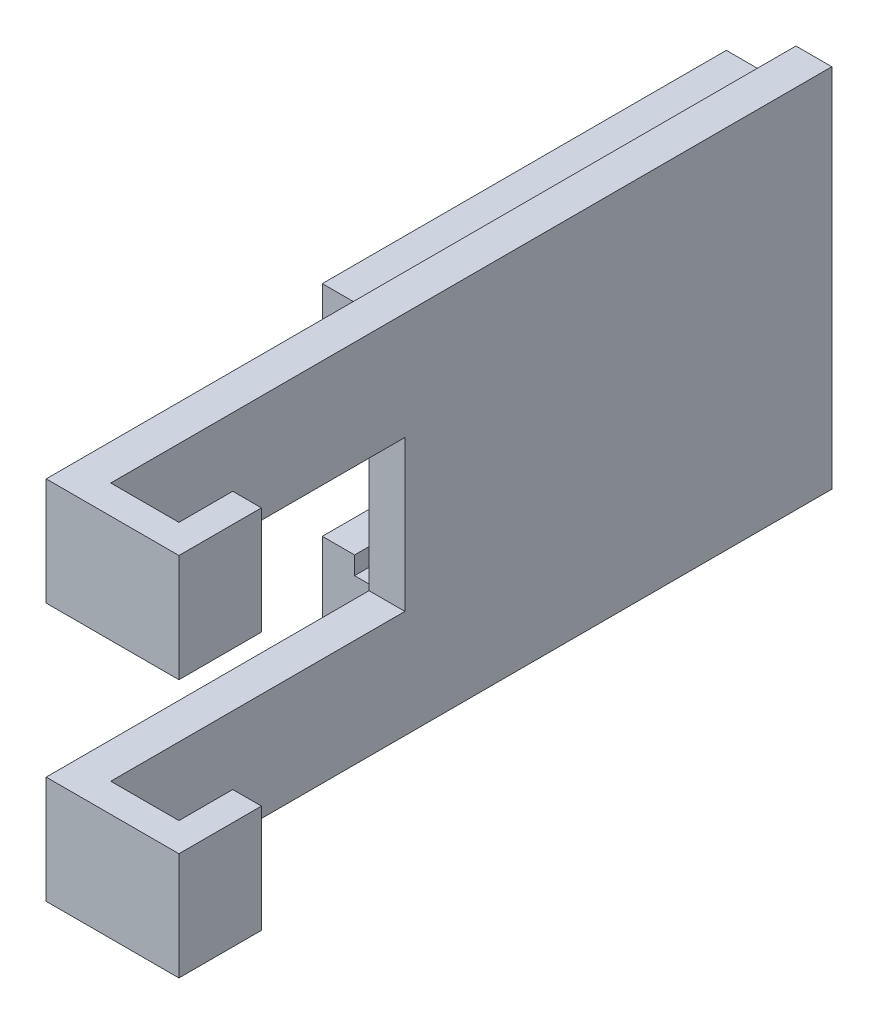
ISO-10303-21;
HEADER;
FILE_DESCRIPTION(('STEP AP214'),'2;1');
FILE_NAME('part.step','',(''),(''),'','','');
FILE_SCHEMA(('AUTOMOTIVE_DESIGN { 1 0 10303 214 1 1 1 1 }'));
ENDSEC;
DATA;
#1=APPLICATION_CONTEXT('core data for automotive mechanical design processes');
#2=APPLICATION_PROTOCOL_DEFINITION('international standard','automotive_design',2000,#1);
#3=PRODUCT_CONTEXT('',#1,'mechanical');
#4=PRODUCT('Part','Part','',(#3));
#5=PRODUCT_RELATED_PRODUCT_CATEGORY('part','',(#4));
#6=PRODUCT_DEFINITION_FORMATION('','',#4);
#7=PRODUCT_DEFINITION_CONTEXT('part definition',#1,'design');
#8=PRODUCT_DEFINITION('design','',#6,#7);
#9=PRODUCT_DEFINITION_SHAPE('','',#8);
#10=(LENGTH_UNIT() NAMED_UNIT(*) SI_UNIT(.MILLI.,.METRE.));
#11=(NAMED_UNIT(*) PLANE_ANGLE_UNIT() SI_UNIT($,.RADIAN.));
#12=(NAMED_UNIT(*) SI_UNIT($,.STERADIAN.) SOLID_ANGLE_UNIT());
#13=UNCERTAINTY_MEASURE_WITH_UNIT(LENGTH_MEASURE(1.E-05),#10,'distance_accuracy_value','');
#14=(GEOMETRIC_REPRESENTATION_CONTEXT(3) GLOBAL_UNCERTAINTY_ASSIGNED_CONTEXT((#13)) GLOBAL_UNIT_ASSIGNED_CONTEXT((#10,
#11,#12)) REPRESENTATION_CONTEXT('',''));
#15=CARTESIAN_POINT('',(0.,0.,0.));
#16=DIRECTION('',(0.,0.,1.));
#17=DIRECTION('',(1.,0.,0.));
#18=AXIS2_PLACEMENT_3D('',#15,#16,#17);
#19=CARTESIAN_POINT('',(0.,0.,0.));
#20=DIRECTION('',(1.,0.,0.));
#21=DIRECTION('',(0.,0.,-1.));
#22=AXIS2_PLACEMENT_3D('',#19,#20,#21);
#23=PLANE('',#22);
#24=DIRECTION('',(0.,1.,0.));
#25=VECTOR('',#24,1.);
#26=CARTESIAN_POINT('',(0.,0.,148.102722556875));
#27=LINE('',#26,#25);
#28=CARTESIAN_POINT('',(0.,-10.2956016158861,148.102722556875));
#29=VERTEX_POINT('',#28);
#30=CARTESIAN_POINT('',(0.,15.454398384114,148.102722556875));
#31=VERTEX_POINT('',#30);
#32=EDGE_CURVE('E473',#29,#31,#27,.T.);
#33=ORIENTED_EDGE('',*,*,#32,.F.);
#34=DIRECTION('',(0.,0.,1.));
#35=VECTOR('',#34,1.);
#36=CARTESIAN_POINT('',(0.,-10.2956016158862,204.4196490452));
#37=LINE('',#36,#35);
#38=CARTESIAN_POINT('',(0.,-10.2956016158862,204.4196490452));
#39=VERTEX_POINT('',#38);
#40=EDGE_CURVE('E52',#29,#39,#37,.T.);
#41=ORIENTED_EDGE('',*,*,#40,.T.);
#42=DIRECTION('',(0.,-1.,0.));
#43=VECTOR('',#42,1.);
#44=CARTESIAN_POINT('',(0.,-15.0456016158862,204.4196490452));
#45=LINE('',#44,#43);
#46=CARTESIAN_POINT('',(0.,-15.0456016158862,204.4196490452));
#47=VERTEX_POINT('',#46);
#48=EDGE_CURVE('E261',#39,#47,#45,.T.);
#49=ORIENTED_EDGE('',*,*,#48,.T.);
#50=DIRECTION('',(0.,0.,-1.));
#51=VECTOR('',#50,1.);
#52=CARTESIAN_POINT('',(0.,-15.0456016158862,204.4196490452));
#53=LINE('',#52,#51);
#54=CARTESIAN_POINT('',(0.,-15.0456016158861,148.102722556875));
#55=VERTEX_POINT('',#54);
#56=EDGE_CURVE('E299',#47,#55,#53,.T.);
#57=ORIENTED_EDGE('',*,*,#56,.T.);
#58=CARTESIAN_POINT('',(0.,-22.920601615886,148.102722556875));
#59=VERTEX_POINT('',#58);
#60=EDGE_CURVE('E469',#59,#55,#27,.T.);
#61=ORIENTED_EDGE('',*,*,#60,.F.);
#62=DIRECTION('',(0.,0.,-1.));
#63=VECTOR('',#62,1.);
#64=CARTESIAN_POINT('',(0.,-22.920601615886,0.));
#65=LINE('',#64,#63);
#66=CARTESIAN_POINT('',(0.,-22.920601615886,252.602722556875));
#67=VERTEX_POINT('',#66);
#68=EDGE_CURVE('E466',#67,#59,#65,.T.);
#69=ORIENTED_EDGE('',*,*,#68,.F.);
#70=DIRECTION('',(0.,-1.,0.));
#71=VECTOR('',#70,1.);
#72=CARTESIAN_POINT('',(0.,0.,252.602722556875));
#73=LINE('',#72,#71);
#74=CARTESIAN_POINT('',(0.,-7.92060161588596,252.602722556875));
#75=VERTEX_POINT('',#74);
#76=EDGE_CURVE('E464',#75,#67,#73,.T.);
#77=ORIENTED_EDGE('',*,*,#76,.F.);
#78=DIRECTION('',(0.,0.,-1.));
#79=VECTOR('',#78,1.);
#80=CARTESIAN_POINT('',(0.,-7.92060161588596,0.));
#81=LINE('',#80,#79);
#82=CARTESIAN_POINT('',(0.,-7.92060161588596,207.602722556875));
#83=VERTEX_POINT('',#82);
#84=EDGE_CURVE('E461',#75,#83,#81,.T.);
#85=ORIENTED_EDGE('',*,*,#84,.T.);
#86=DIRECTION('',(0.,-1.,0.));
#87=VECTOR('',#86,1.);
#88=CARTESIAN_POINT('',(0.,0.,207.602722556875));
#89=LINE('',#88,#87);
#90=CARTESIAN_POINT('',(0.,13.079398384114,207.602722556875));
#91=VERTEX_POINT('',#90);
#92=EDGE_CURVE('E458',#91,#83,#89,.T.);
#93=ORIENTED_EDGE('',*,*,#92,.F.);
#94=DIRECTION('',(0.,0.,-1.));
#95=VECTOR('',#94,1.);
#96=CARTESIAN_POINT('',(0.,13.0793983841141,0.));
#97=LINE('',#96,#95);
#98=CARTESIAN_POINT('',(0.,13.079398384114,252.602722556875));
#99=VERTEX_POINT('',#98);
#100=EDGE_CURVE('E439',#99,#91,#97,.T.);
#101=ORIENTED_EDGE('',*,*,#100,.F.);
#102=DIRECTION('',(0.,1.,0.));
#103=VECTOR('',#102,1.);
#104=CARTESIAN_POINT('',(0.,0.,252.602722556875));
#105=LINE('',#104,#103);
#106=CARTESIAN_POINT('',(0.,28.079398384114,252.602722556875));
#107=VERTEX_POINT('',#106);
#108=EDGE_CURVE('E443',#99,#107,#105,.T.);
#109=ORIENTED_EDGE('',*,*,#108,.T.);
#110=DIRECTION('',(0.,0.,-1.));
#111=VECTOR('',#110,1.);
#112=CARTESIAN_POINT('',(0.,28.079398384114,0.));
#113=LINE('',#112,#111);
#114=CARTESIAN_POINT('',(0.,28.079398384114,148.102722556875));
#115=VERTEX_POINT('',#114);
#116=EDGE_CURVE('E472',#107,#115,#113,.T.);
#117=ORIENTED_EDGE('',*,*,#116,.T.);
#118=CARTESIAN_POINT('',(0.,20.204398384114,148.102722556875));
#119=VERTEX_POINT('',#118);
#120=EDGE_CURVE('E468',#119,#115,#27,.T.);
#121=ORIENTED_EDGE('',*,*,#120,.F.);
#122=DIRECTION('',(0.,0.,-1.));
#123=VECTOR('',#122,1.);
#124=CARTESIAN_POINT('',(0.,20.204398384114,204.4196490452));
#125=LINE('',#124,#123);
#126=CARTESIAN_POINT('',(0.,20.204398384114,204.4196490452));
#127=VERTEX_POINT('',#126);
#128=EDGE_CURVE('E357',#127,#119,#125,.T.);
#129=ORIENTED_EDGE('',*,*,#128,.F.);
#130=DIRECTION('',(0.,1.,0.));
#131=VECTOR('',#130,1.);
#132=CARTESIAN_POINT('',(0.,20.204398384114,204.4196490452));
#133=LINE('',#132,#131);
#134=CARTESIAN_POINT('',(0.,15.454398384114,204.4196490452));
#135=VERTEX_POINT('',#134);
#136=EDGE_CURVE('E60',#135,#127,#133,.T.);
#137=ORIENTED_EDGE('',*,*,#136,.F.);
#138=DIRECTION('',(0.,0.,1.));
#139=VECTOR('',#138,1.);
#140=CARTESIAN_POINT('',(0.,15.454398384114,204.4196490452));
#141=LINE('',#140,#139);
#142=EDGE_CURVE('E352',#31,#135,#141,.T.);
#143=ORIENTED_EDGE('',*,*,#142,.F.);
#144=EDGE_LOOP('',(#33,#41,#49,#57,#61,#69,#77,#85,#93,#101,#109,#117,#121,#129,#137,#143));
#145=FACE_BOUND('',#144,.T.);
#146=ADVANCED_FACE('F37',(#145),#23,.F.);
#147=CARTESIAN_POINT('',(18.5,0.,248.602722556875));
#148=DIRECTION('',(0.,0.,-1.));
#149=DIRECTION('',(-1.,0.,0.));
#150=AXIS2_PLACEMENT_3D('',#147,#148,#149);
#151=PLANE('',#150);
#152=DIRECTION('',(-1.,0.,0.));
#153=VECTOR('',#152,1.);
#154=CARTESIAN_POINT('',(18.5,28.079398384114,248.602722556875));
#155=LINE('',#154,#153);
#156=CARTESIAN_POINT('',(14.5,28.079398384114,248.602722556875));
#157=VERTEX_POINT('',#156);
#158=CARTESIAN_POINT('',(5.,28.079398384114,248.602722556875));
#159=VERTEX_POINT('',#158);
#160=EDGE_CURVE('E437',#157,#159,#155,.T.);
#161=ORIENTED_EDGE('',*,*,#160,.F.);
#162=DIRECTION('',(0.,1.,0.));
#163=VECTOR('',#162,1.);
#164=CARTESIAN_POINT('',(14.5,13.079398384114,248.602722556875));
#165=LINE('',#164,#163);
#166=CARTESIAN_POINT('',(14.5,13.079398384114,248.602722556875));
#167=VERTEX_POINT('',#166);
#168=EDGE_CURVE('E372',#167,#157,#165,.T.);
#169=ORIENTED_EDGE('',*,*,#168,.F.);
#170=DIRECTION('',(-1.,0.,0.));
#171=VECTOR('',#170,1.);
#172=CARTESIAN_POINT('',(18.5,13.079398384114,248.602722556875));
#173=LINE('',#172,#171);
#174=CARTESIAN_POINT('',(5.,13.079398384114,248.602722556875));
#175=VERTEX_POINT('',#174);
#176=EDGE_CURVE('E433',#167,#175,#173,.T.);
#177=ORIENTED_EDGE('',*,*,#176,.T.);
#178=DIRECTION('',(0.,-1.,0.));
#179=VECTOR('',#178,1.);
#180=CARTESIAN_POINT('',(5.,0.,248.602722556875));
#181=LINE('',#180,#179);
#182=EDGE_CURVE('E418',#159,#175,#181,.T.);
#183=ORIENTED_EDGE('',*,*,#182,.F.);
#184=EDGE_LOOP('',(#161,#169,#177,#183));
#185=FACE_BOUND('',#184,.T.);
#186=ADVANCED_FACE('F560',(#185),#151,.T.);
#187=CARTESIAN_POINT('',(18.5,-7.92060161588596,248.602722556875));
#188=DIRECTION('',(0.,0.,-1.));
#189=DIRECTION('',(-1.,0.,0.));
#190=AXIS2_PLACEMENT_3D('',#187,#188,#189);
#191=PLANE('',#190);
#192=DIRECTION('',(-1.,0.,0.));
#193=VECTOR('',#192,1.);
#194=CARTESIAN_POINT('',(18.5,-7.92060161588596,248.602722556875));
#195=LINE('',#194,#193);
#196=CARTESIAN_POINT('',(14.5,-7.92060161588596,248.602722556875));
#197=VERTEX_POINT('',#196);
#198=CARTESIAN_POINT('',(5.,-7.92060161588596,248.602722556875));
#199=VERTEX_POINT('',#198);
#200=EDGE_CURVE('E411',#197,#199,#195,.T.);
#201=ORIENTED_EDGE('',*,*,#200,.F.);
#202=DIRECTION('',(0.,1.,0.));
#203=VECTOR('',#202,1.);
#204=CARTESIAN_POINT('',(14.5,-22.920601615886,248.602722556875));
#205=LINE('',#204,#203);
#206=CARTESIAN_POINT('',(14.5,-22.920601615886,248.602722556875));
#207=VERTEX_POINT('',#206);
#208=EDGE_CURVE('E391',#207,#197,#205,.T.);
#209=ORIENTED_EDGE('',*,*,#208,.F.);
#210=DIRECTION('',(-1.,0.,0.));
#211=VECTOR('',#210,1.);
#212=CARTESIAN_POINT('',(18.5,-22.920601615886,248.602722556875));
#213=LINE('',#212,#211);
#214=CARTESIAN_POINT('',(5.,-22.920601615886,248.602722556875));
#215=VERTEX_POINT('',#214);
#216=EDGE_CURVE('E410',#207,#215,#213,.T.);
#217=ORIENTED_EDGE('',*,*,#216,.T.);
#218=DIRECTION('',(0.,-1.,0.));
#219=VECTOR('',#218,1.);
#220=CARTESIAN_POINT('',(5.,-7.92060161588596,248.602722556875));
#221=LINE('',#220,#219);
#222=EDGE_CURVE('E415',#199,#215,#221,.T.);
#223=ORIENTED_EDGE('',*,*,#222,.F.);
#224=EDGE_LOOP('',(#201,#209,#217,#223));
#225=FACE_BOUND('',#224,.T.);
#226=ADVANCED_FACE('F529',(#225),#191,.T.);
#227=CARTESIAN_POINT('',(5.,0.,0.));
#228=DIRECTION('',(1.,0.,0.));
#229=DIRECTION('',(0.,0.,-1.));
#230=AXIS2_PLACEMENT_3D('',#227,#228,#229);
#231=PLANE('',#230);
#232=ORIENTED_EDGE('',*,*,#222,.T.);
#233=DIRECTION('',(0.,0.,-1.));
#234=VECTOR('',#233,1.);
#235=CARTESIAN_POINT('',(5.,-22.920601615886,0.));
#236=LINE('',#235,#234);
#237=CARTESIAN_POINT('',(5.,-22.920601615886,148.102722556875));
#238=VERTEX_POINT('',#237);
#239=EDGE_CURVE('E448',#215,#238,#236,.T.);
#240=ORIENTED_EDGE('',*,*,#239,.T.);
#241=DIRECTION('',(0.,1.,0.));
#242=VECTOR('',#241,1.);
#243=CARTESIAN_POINT('',(5.,0.,148.102722556875));
#244=LINE('',#243,#242);
#245=CARTESIAN_POINT('',(5.,28.079398384114,148.102722556875));
#246=VERTEX_POINT('',#245);
#247=EDGE_CURVE('E450',#238,#246,#244,.T.);
#248=ORIENTED_EDGE('',*,*,#247,.T.);
#249=DIRECTION('',(0.,0.,-1.));
#250=VECTOR('',#249,1.);
#251=CARTESIAN_POINT('',(5.,28.079398384114,0.));
#252=LINE('',#251,#250);
#253=EDGE_CURVE('E453',#159,#246,#252,.T.);
#254=ORIENTED_EDGE('',*,*,#253,.F.);
#255=ORIENTED_EDGE('',*,*,#182,.T.);
#256=DIRECTION('',(0.,0.,-1.));
#257=VECTOR('',#256,1.);
#258=CARTESIAN_POINT('',(5.,13.0793983841141,0.));
#259=LINE('',#258,#257);
#260=CARTESIAN_POINT('',(5.,13.079398384114,207.602722556875));
#261=VERTEX_POINT('',#260);
#262=EDGE_CURVE('E440',#175,#261,#259,.T.);
#263=ORIENTED_EDGE('',*,*,#262,.T.);
#264=DIRECTION('',(0.,-1.,0.));
#265=VECTOR('',#264,1.);
#266=CARTESIAN_POINT('',(5.,0.,207.602722556875));
#267=LINE('',#266,#265);
#268=CARTESIAN_POINT('',(5.,-7.92060161588596,207.602722556875));
#269=VERTEX_POINT('',#268);
#270=EDGE_CURVE('E442',#261,#269,#267,.T.);
#271=ORIENTED_EDGE('',*,*,#270,.T.);
#272=DIRECTION('',(0.,0.,-1.));
#273=VECTOR('',#272,1.);
#274=CARTESIAN_POINT('',(5.,-7.92060161588596,0.));
#275=LINE('',#274,#273);
#276=EDGE_CURVE('E446',#199,#269,#275,.T.);
#277=ORIENTED_EDGE('',*,*,#276,.F.);
#278=EDGE_LOOP('',(#232,#240,#248,#254,#255,#263,#271,#277));
#279=FACE_BOUND('',#278,.T.);
#280=ADVANCED_FACE('F528',(#279),#231,.T.);
#281=CARTESIAN_POINT('',(5.,13.0793983841141,0.));
#282=DIRECTION('',(0.,1.,0.));
#283=DIRECTION('',(0.,0.,1.));
#284=AXIS2_PLACEMENT_3D('',#281,#282,#283);
#285=PLANE('',#284);
#286=ORIENTED_EDGE('',*,*,#100,.T.);
#287=DIRECTION('',(-1.,0.,0.));
#288=VECTOR('',#287,1.);
#289=CARTESIAN_POINT('',(5.,13.079398384114,207.602722556875));
#290=LINE('',#289,#288);
#291=EDGE_CURVE('E11',#261,#91,#290,.T.);
#292=ORIENTED_EDGE('',*,*,#291,.F.);
#293=ORIENTED_EDGE('',*,*,#262,.F.);
#294=ORIENTED_EDGE('',*,*,#176,.F.);
#295=DIRECTION('',(0.,0.,1.));
#296=VECTOR('',#295,1.);
#297=CARTESIAN_POINT('',(14.5,13.079398384114,241.102722556875));
#298=LINE('',#297,#296);
#299=CARTESIAN_POINT('',(14.5,13.079398384114,241.102722556875));
#300=VERTEX_POINT('',#299);
#301=EDGE_CURVE('E388',#300,#167,#298,.T.);
#302=ORIENTED_EDGE('',*,*,#301,.F.);
#303=DIRECTION('',(-1.,0.,0.));
#304=VECTOR('',#303,1.);
#305=CARTESIAN_POINT('',(18.5,13.079398384114,241.102722556875));
#306=LINE('',#305,#304);
#307=CARTESIAN_POINT('',(18.5,13.079398384114,241.102722556875));
#308=VERTEX_POINT('',#307);
#309=EDGE_CURVE('E376',#308,#300,#306,.T.);
#310=ORIENTED_EDGE('',*,*,#309,.F.);
#311=DIRECTION('',(0.,0.,-1.));
#312=VECTOR('',#311,1.);
#313=CARTESIAN_POINT('',(18.5,13.0793983841141,0.));
#314=LINE('',#313,#312);
#315=CARTESIAN_POINT('',(18.5,13.079398384114,252.602722556875));
#316=VERTEX_POINT('',#315);
#317=EDGE_CURVE('E431',#316,#308,#314,.T.);
#318=ORIENTED_EDGE('',*,*,#317,.F.);
#319=DIRECTION('',(-1.,0.,0.));
#320=VECTOR('',#319,1.);
#321=CARTESIAN_POINT('',(5.,13.079398384114,252.602722556875));
#322=LINE('',#321,#320);
#323=EDGE_CURVE('E455',#316,#99,#322,.T.);
#324=ORIENTED_EDGE('',*,*,#323,.T.);
#325=EDGE_LOOP('',(#286,#292,#293,#294,#302,#310,#318,#324));
#326=FACE_BOUND('',#325,.T.);
#327=ADVANCED_FACE('F39',(#326),#285,.F.);
#328=CARTESIAN_POINT('',(5.,0.,207.602722556875));
#329=DIRECTION('',(0.,0.,-1.));
#330=DIRECTION('',(-1.,0.,0.));
#331=AXIS2_PLACEMENT_3D('',#328,#329,#330);
#332=PLANE('',#331);
#333=ORIENTED_EDGE('',*,*,#92,.T.);
#334=DIRECTION('',(-1.,0.,0.));
#335=VECTOR('',#334,1.);
#336=CARTESIAN_POINT('',(5.,-7.92060161588596,207.602722556875));
#337=LINE('',#336,#335);
#338=EDGE_CURVE('E45',#269,#83,#337,.T.);
#339=ORIENTED_EDGE('',*,*,#338,.F.);
#340=ORIENTED_EDGE('',*,*,#270,.F.);
#341=ORIENTED_EDGE('',*,*,#291,.T.);
#342=EDGE_LOOP('',(#333,#339,#340,#341));
#343=FACE_BOUND('',#342,.T.);
#344=ADVANCED_FACE('F498',(#343),#332,.F.);
#345=CARTESIAN_POINT('',(5.,-7.92060161588596,0.));
#346=DIRECTION('',(0.,1.,0.));
#347=DIRECTION('',(0.,0.,1.));
#348=AXIS2_PLACEMENT_3D('',#345,#346,#347);
#349=PLANE('',#348);
#350=ORIENTED_EDGE('',*,*,#84,.F.);
#351=DIRECTION('',(-1.,0.,0.));
#352=VECTOR('',#351,1.);
#353=CARTESIAN_POINT('',(5.,-7.92060161588596,252.602722556875));
#354=LINE('',#353,#352);
#355=CARTESIAN_POINT('',(18.5,-7.92060161588596,252.602722556875));
#356=VERTEX_POINT('',#355);
#357=EDGE_CURVE('E490',#356,#75,#354,.T.);
#358=ORIENTED_EDGE('',*,*,#357,.F.);
#359=DIRECTION('',(0.,0.,-1.));
#360=VECTOR('',#359,1.);
#361=CARTESIAN_POINT('',(18.5,-7.92060161588596,252.602722556875));
#362=LINE('',#361,#360);
#363=CARTESIAN_POINT('',(18.5,-7.92060161588596,241.102722556875));
#364=VERTEX_POINT('',#363);
#365=EDGE_CURVE('E419',#356,#364,#362,.T.);
#366=ORIENTED_EDGE('',*,*,#365,.T.);
#367=DIRECTION('',(1.,0.,0.));
#368=VECTOR('',#367,1.);
#369=CARTESIAN_POINT('',(18.5,-7.92060161588596,241.102722556875));
#370=LINE('',#369,#368);
#371=CARTESIAN_POINT('',(14.5,-7.92060161588596,241.102722556875));
#372=VERTEX_POINT('',#371);
#373=EDGE_CURVE('E399',#372,#364,#370,.T.);
#374=ORIENTED_EDGE('',*,*,#373,.F.);
#375=DIRECTION('',(0.,0.,1.));
#376=VECTOR('',#375,1.);
#377=CARTESIAN_POINT('',(14.5,-7.92060161588596,241.102722556875));
#378=LINE('',#377,#376);
#379=EDGE_CURVE('E402',#372,#197,#378,.T.);
#380=ORIENTED_EDGE('',*,*,#379,.T.);
#381=ORIENTED_EDGE('',*,*,#200,.T.);
#382=ORIENTED_EDGE('',*,*,#276,.T.);
#383=ORIENTED_EDGE('',*,*,#338,.T.);
#384=EDGE_LOOP('',(#350,#358,#366,#374,#380,#381,#382,#383));
#385=FACE_BOUND('',#384,.T.);
#386=ADVANCED_FACE('F494',(#385),#349,.T.);
#387=CARTESIAN_POINT('',(5.,0.,252.602722556875));
#388=DIRECTION('',(0.,0.,-1.));
#389=DIRECTION('',(-1.,0.,0.));
#390=AXIS2_PLACEMENT_3D('',#387,#388,#389);
#391=PLANE('',#390);
#392=ORIENTED_EDGE('',*,*,#76,.T.);
#393=DIRECTION('',(-1.,0.,0.));
#394=VECTOR('',#393,1.);
#395=CARTESIAN_POINT('',(5.,-22.920601615886,252.602722556875));
#396=LINE('',#395,#394);
#397=CARTESIAN_POINT('',(18.5,-22.920601615886,252.602722556875));
#398=VERTEX_POINT('',#397);
#399=EDGE_CURVE('E487',#398,#67,#396,.T.);
#400=ORIENTED_EDGE('',*,*,#399,.F.);
#401=DIRECTION('',(0.,-1.,0.));
#402=VECTOR('',#401,1.);
#403=CARTESIAN_POINT('',(18.5,-7.92060161588596,252.602722556875));
#404=LINE('',#403,#402);
#405=EDGE_CURVE('E413',#356,#398,#404,.T.);
#406=ORIENTED_EDGE('',*,*,#405,.F.);
#407=ORIENTED_EDGE('',*,*,#357,.T.);
#408=EDGE_LOOP('',(#392,#400,#406,#407));
#409=FACE_BOUND('',#408,.T.);
#410=ADVANCED_FACE('F506',(#409),#391,.F.);
#411=CARTESIAN_POINT('',(5.,-22.920601615886,0.));
#412=DIRECTION('',(0.,1.,0.));
#413=DIRECTION('',(0.,0.,1.));
#414=AXIS2_PLACEMENT_3D('',#411,#412,#413);
#415=PLANE('',#414);
#416=ORIENTED_EDGE('',*,*,#68,.T.);
#417=DIRECTION('',(-1.,0.,0.));
#418=VECTOR('',#417,1.);
#419=CARTESIAN_POINT('',(5.,-22.920601615886,148.102722556875));
#420=LINE('',#419,#418);
#421=EDGE_CURVE('E484',#238,#59,#420,.T.);
#422=ORIENTED_EDGE('',*,*,#421,.F.);
#423=ORIENTED_EDGE('',*,*,#239,.F.);
#424=ORIENTED_EDGE('',*,*,#216,.F.);
#425=DIRECTION('',(0.,0.,1.));
#426=VECTOR('',#425,1.);
#427=CARTESIAN_POINT('',(14.5,-22.920601615886,241.102722556875));
#428=LINE('',#427,#426);
#429=CARTESIAN_POINT('',(14.5,-22.920601615886,241.102722556875));
#430=VERTEX_POINT('',#429);
#431=EDGE_CURVE('E407',#430,#207,#428,.T.);
#432=ORIENTED_EDGE('',*,*,#431,.F.);
#433=DIRECTION('',(-1.,0.,0.));
#434=VECTOR('',#433,1.);
#435=CARTESIAN_POINT('',(18.5,-22.920601615886,241.102722556875));
#436=LINE('',#435,#434);
#437=CARTESIAN_POINT('',(18.5,-22.920601615886,241.102722556875));
#438=VERTEX_POINT('',#437);
#439=EDGE_CURVE('E395',#438,#430,#436,.T.);
#440=ORIENTED_EDGE('',*,*,#439,.F.);
#441=DIRECTION('',(0.,0.,-1.));
#442=VECTOR('',#441,1.);
#443=CARTESIAN_POINT('',(18.5,-22.920601615886,252.602722556875));
#444=LINE('',#443,#442);
#445=EDGE_CURVE('E422',#398,#438,#444,.T.);
#446=ORIENTED_EDGE('',*,*,#445,.F.);
#447=ORIENTED_EDGE('',*,*,#399,.T.);
#448=EDGE_LOOP('',(#416,#422,#423,#424,#432,#440,#446,#447));
#449=FACE_BOUND('',#448,.T.);
#450=ADVANCED_FACE('F510',(#449),#415,.F.);
#451=CARTESIAN_POINT('',(5.,0.,148.102722556875));
#452=DIRECTION('',(0.,0.,1.));
#453=DIRECTION('',(1.,0.,0.));
#454=AXIS2_PLACEMENT_3D('',#451,#452,#453);
#455=PLANE('',#454);
#456=ORIENTED_EDGE('',*,*,#60,.T.);
#457=DIRECTION('',(1.,0.,0.));
#458=VECTOR('',#457,1.);
#459=CARTESIAN_POINT('',(-5.2,-15.0456016158861,148.102722556875));
#460=LINE('',#459,#458);
#461=CARTESIAN_POINT('',(-5.2,-15.0456016158862,148.102722556875));
#462=VERTEX_POINT('',#461);
#463=EDGE_CURVE('E309',#462,#55,#460,.T.);
#464=ORIENTED_EDGE('',*,*,#463,.F.);
#465=DIRECTION('',(0.,1.,0.));
#466=VECTOR('',#465,1.);
#467=CARTESIAN_POINT('',(-5.2,-17.5456016158861,148.102722556875));
#468=LINE('',#467,#466);
#469=CARTESIAN_POINT('',(-5.2,-17.5456016158861,148.102722556875));
#470=VERTEX_POINT('',#469);
#471=EDGE_CURVE('E287',#470,#462,#468,.T.);
#472=ORIENTED_EDGE('',*,*,#471,.F.);
#473=DIRECTION('',(1.,0.,0.));
#474=VECTOR('',#473,1.);
#475=CARTESIAN_POINT('',(-9.7,-17.5456016158861,148.102722556875));
#476=LINE('',#475,#474);
#477=CARTESIAN_POINT('',(-9.7,-17.5456016158861,148.102722556875));
#478=VERTEX_POINT('',#477);
#479=EDGE_CURVE('E292',#478,#470,#476,.T.);
#480=ORIENTED_EDGE('',*,*,#479,.F.);
#481=DIRECTION('',(0.,1.,0.));
#482=VECTOR('',#481,1.);
#483=CARTESIAN_POINT('',(-9.7,-17.5456016158861,148.102722556875));
#484=LINE('',#483,#482);
#485=CARTESIAN_POINT('',(-9.7,-7.79560161588613,148.102722556875));
#486=VERTEX_POINT('',#485);
#487=EDGE_CURVE('E276',#478,#486,#484,.T.);
#488=ORIENTED_EDGE('',*,*,#487,.T.);
#489=DIRECTION('',(1.,0.,0.));
#490=VECTOR('',#489,1.);
#491=CARTESIAN_POINT('',(-9.7,-7.79560161588613,148.102722556875));
#492=LINE('',#491,#490);
#493=CARTESIAN_POINT('',(-5.2,-7.79560161588613,148.102722556875));
#494=VERTEX_POINT('',#493);
#495=EDGE_CURVE('E262',#486,#494,#492,.T.);
#496=ORIENTED_EDGE('',*,*,#495,.T.);
#497=CARTESIAN_POINT('',(-5.2,-10.2956016158861,148.102722556875));
#498=VERTEX_POINT('',#497);
#499=EDGE_CURVE('E286',#498,#494,#468,.T.);
#500=ORIENTED_EDGE('',*,*,#499,.F.);
#501=DIRECTION('',(1.,0.,0.));
#502=VECTOR('',#501,1.);
#503=CARTESIAN_POINT('',(-5.2,-10.2956016158861,148.102722556875));
#504=LINE('',#503,#502);
#505=EDGE_CURVE('E311',#498,#29,#504,.T.);
#506=ORIENTED_EDGE('',*,*,#505,.T.);
#507=ORIENTED_EDGE('',*,*,#32,.T.);
#508=DIRECTION('',(1.,0.,0.));
#509=VECTOR('',#508,1.);
#510=CARTESIAN_POINT('',(-5.2,15.454398384114,148.102722556875));
#511=LINE('',#510,#509);
#512=CARTESIAN_POINT('',(-5.2,15.454398384114,148.102722556875));
#513=VERTEX_POINT('',#512);
#514=EDGE_CURVE('E363',#513,#31,#511,.T.);
#515=ORIENTED_EDGE('',*,*,#514,.F.);
#516=DIRECTION('',(0.,-1.,0.));
#517=VECTOR('',#516,1.);
#518=CARTESIAN_POINT('',(-5.2,22.704398384114,148.102722556875));
#519=LINE('',#518,#517);
#520=CARTESIAN_POINT('',(-5.2,12.954398384114,148.102722556875));
#521=VERTEX_POINT('',#520);
#522=EDGE_CURVE('E332',#513,#521,#519,.T.);
#523=ORIENTED_EDGE('',*,*,#522,.T.);
#524=DIRECTION('',(1.,0.,0.));
#525=VECTOR('',#524,1.);
#526=CARTESIAN_POINT('',(-9.7,12.954398384114,148.102722556875));
#527=LINE('',#526,#525);
#528=CARTESIAN_POINT('',(-9.7,12.954398384114,148.102722556875));
#529=VERTEX_POINT('',#528);
#530=EDGE_CURVE('E339',#529,#521,#527,.T.);
#531=ORIENTED_EDGE('',*,*,#530,.F.);
#532=DIRECTION('',(0.,-1.,0.));
#533=VECTOR('',#532,1.);
#534=CARTESIAN_POINT('',(-9.7,22.704398384114,148.102722556875));
#535=LINE('',#534,#533);
#536=CARTESIAN_POINT('',(-9.7,22.704398384114,148.102722556875));
#537=VERTEX_POINT('',#536);
#538=EDGE_CURVE('E322',#537,#529,#535,.T.);
#539=ORIENTED_EDGE('',*,*,#538,.F.);
#540=DIRECTION('',(1.,0.,0.));
#541=VECTOR('',#540,1.);
#542=CARTESIAN_POINT('',(-9.7,22.704398384114,148.102722556875));
#543=LINE('',#542,#541);
#544=CARTESIAN_POINT('',(-5.2,22.704398384114,148.102722556875));
#545=VERTEX_POINT('',#544);
#546=EDGE_CURVE('E342',#537,#545,#543,.T.);
#547=ORIENTED_EDGE('',*,*,#546,.T.);
#548=CARTESIAN_POINT('',(-5.2,20.204398384114,148.102722556875));
#549=VERTEX_POINT('',#548);
#550=EDGE_CURVE('E333',#545,#549,#519,.T.);
#551=ORIENTED_EDGE('',*,*,#550,.T.);
#552=DIRECTION('',(1.,0.,0.));
#553=VECTOR('',#552,1.);
#554=CARTESIAN_POINT('',(-5.2,20.204398384114,148.102722556875));
#555=LINE('',#554,#553);
#556=EDGE_CURVE('E366',#549,#119,#555,.T.);
#557=ORIENTED_EDGE('',*,*,#556,.T.);
#558=ORIENTED_EDGE('',*,*,#120,.T.);
#559=DIRECTION('',(-1.,0.,0.));
#560=VECTOR('',#559,1.);
#561=CARTESIAN_POINT('',(5.,28.079398384114,148.102722556875));
#562=LINE('',#561,#560);
#563=EDGE_CURVE('E481',#246,#115,#562,.T.);
#564=ORIENTED_EDGE('',*,*,#563,.F.);
#565=ORIENTED_EDGE('',*,*,#247,.F.);
#566=ORIENTED_EDGE('',*,*,#421,.T.);
#567=EDGE_LOOP('',(#456,#464,#472,#480,#488,#496,#500,#506,#507,#515,#523,#531,#539,#547,#551,
#557,#558,#564,#565,#566));
#568=FACE_BOUND('',#567,.T.);
#569=ADVANCED_FACE('F536',(#568),#455,.F.);
#570=CARTESIAN_POINT('',(5.,28.079398384114,0.));
#571=DIRECTION('',(0.,1.,0.));
#572=DIRECTION('',(0.,0.,1.));
#573=AXIS2_PLACEMENT_3D('',#570,#571,#572);
#574=PLANE('',#573);
#575=ORIENTED_EDGE('',*,*,#116,.F.);
#576=DIRECTION('',(-1.,0.,0.));
#577=VECTOR('',#576,1.);
#578=CARTESIAN_POINT('',(5.,28.079398384114,252.602722556875));
#579=LINE('',#578,#577);
#580=CARTESIAN_POINT('',(18.5,28.079398384114,252.602722556875));
#581=VERTEX_POINT('',#580);
#582=EDGE_CURVE('E479',#581,#107,#579,.T.);
#583=ORIENTED_EDGE('',*,*,#582,.F.);
#584=DIRECTION('',(0.,0.,1.));
#585=VECTOR('',#584,1.);
#586=CARTESIAN_POINT('',(18.5,28.079398384114,0.));
#587=LINE('',#586,#585);
#588=CARTESIAN_POINT('',(18.5,28.079398384114,241.102722556875));
#589=VERTEX_POINT('',#588);
#590=EDGE_CURVE('E425',#589,#581,#587,.T.);
#591=ORIENTED_EDGE('',*,*,#590,.F.);
#592=DIRECTION('',(1.,0.,0.));
#593=VECTOR('',#592,1.);
#594=CARTESIAN_POINT('',(18.5,28.079398384114,241.102722556875));
#595=LINE('',#594,#593);
#596=CARTESIAN_POINT('',(14.5,28.079398384114,241.102722556875));
#597=VERTEX_POINT('',#596);
#598=EDGE_CURVE('E380',#597,#589,#595,.T.);
#599=ORIENTED_EDGE('',*,*,#598,.F.);
#600=DIRECTION('',(0.,0.,1.));
#601=VECTOR('',#600,1.);
#602=CARTESIAN_POINT('',(14.5,28.079398384114,241.102722556875));
#603=LINE('',#602,#601);
#604=EDGE_CURVE('E383',#597,#157,#603,.T.);
#605=ORIENTED_EDGE('',*,*,#604,.T.);
#606=ORIENTED_EDGE('',*,*,#160,.T.);
#607=ORIENTED_EDGE('',*,*,#253,.T.);
#608=ORIENTED_EDGE('',*,*,#563,.T.);
#609=EDGE_LOOP('',(#575,#583,#591,#599,#605,#606,#607,#608));
#610=FACE_BOUND('',#609,.T.);
#611=ADVANCED_FACE('F539',(#610),#574,.T.);
#612=CARTESIAN_POINT('',(5.,0.,252.602722556875));
#613=DIRECTION('',(0.,0.,1.));
#614=DIRECTION('',(1.,0.,0.));
#615=AXIS2_PLACEMENT_3D('',#612,#613,#614);
#616=PLANE('',#615);
#617=ORIENTED_EDGE('',*,*,#108,.F.);
#618=ORIENTED_EDGE('',*,*,#323,.F.);
#619=DIRECTION('',(0.,-1.,0.));
#620=VECTOR('',#619,1.);
#621=CARTESIAN_POINT('',(18.5,0.,252.602722556875));
#622=LINE('',#621,#620);
#623=EDGE_CURVE('E428',#581,#316,#622,.T.);
#624=ORIENTED_EDGE('',*,*,#623,.F.);
#625=ORIENTED_EDGE('',*,*,#582,.T.);
#626=EDGE_LOOP('',(#617,#618,#624,#625));
#627=FACE_BOUND('',#626,.T.);
#628=ADVANCED_FACE('F542',(#627),#616,.T.);
#629=CARTESIAN_POINT('',(18.5,0.,0.));
#630=DIRECTION('',(1.,0.,0.));
#631=DIRECTION('',(0.,0.,-1.));
#632=AXIS2_PLACEMENT_3D('',#629,#630,#631);
#633=PLANE('',#632);
#634=ORIENTED_EDGE('',*,*,#317,.T.);
#635=DIRECTION('',(0.,-1.,0.));
#636=VECTOR('',#635,1.);
#637=CARTESIAN_POINT('',(18.5,13.079398384114,241.102722556875));
#638=LINE('',#637,#636);
#639=EDGE_CURVE('E373',#589,#308,#638,.T.);
#640=ORIENTED_EDGE('',*,*,#639,.F.);
#641=ORIENTED_EDGE('',*,*,#590,.T.);
#642=ORIENTED_EDGE('',*,*,#623,.T.);
#643=EDGE_LOOP('',(#634,#640,#641,#642));
#644=FACE_BOUND('',#643,.T.);
#645=ADVANCED_FACE('F547',(#644),#633,.T.);
#646=CARTESIAN_POINT('',(18.5,0.,0.));
#647=DIRECTION('',(-1.,0.,0.));
#648=DIRECTION('',(0.,0.,1.));
#649=AXIS2_PLACEMENT_3D('',#646,#647,#648);
#650=PLANE('',#649);
#651=ORIENTED_EDGE('',*,*,#365,.F.);
#652=ORIENTED_EDGE('',*,*,#405,.T.);
#653=ORIENTED_EDGE('',*,*,#445,.T.);
#654=DIRECTION('',(0.,-1.,0.));
#655=VECTOR('',#654,1.);
#656=CARTESIAN_POINT('',(18.5,-22.920601615886,241.102722556875));
#657=LINE('',#656,#655);
#658=EDGE_CURVE('E392',#364,#438,#657,.T.);
#659=ORIENTED_EDGE('',*,*,#658,.F.);
#660=EDGE_LOOP('',(#651,#652,#653,#659));
#661=FACE_BOUND('',#660,.T.);
#662=ADVANCED_FACE('F517',(#661),#650,.F.);
#663=CARTESIAN_POINT('',(14.5,-22.920601615886,241.102722556875));
#664=DIRECTION('',(1.,0.,0.));
#665=DIRECTION('',(0.,0.,-1.));
#666=AXIS2_PLACEMENT_3D('',#663,#664,#665);
#667=PLANE('',#666);
#668=ORIENTED_EDGE('',*,*,#208,.T.);
#669=ORIENTED_EDGE('',*,*,#379,.F.);
#670=DIRECTION('',(0.,1.,0.));
#671=VECTOR('',#670,1.);
#672=CARTESIAN_POINT('',(14.5,-22.920601615886,241.102722556875));
#673=LINE('',#672,#671);
#674=EDGE_CURVE('E397',#430,#372,#673,.T.);
#675=ORIENTED_EDGE('',*,*,#674,.F.);
#676=ORIENTED_EDGE('',*,*,#431,.T.);
#677=EDGE_LOOP('',(#668,#669,#675,#676));
#678=FACE_BOUND('',#677,.T.);
#679=ADVANCED_FACE('F524',(#678),#667,.F.);
#680=CARTESIAN_POINT('',(0.,0.,241.102722556875));
#681=DIRECTION('',(0.,0.,1.));
#682=DIRECTION('',(1.,0.,0.));
#683=AXIS2_PLACEMENT_3D('',#680,#681,#682);
#684=PLANE('',#683);
#685=ORIENTED_EDGE('',*,*,#658,.T.);
#686=ORIENTED_EDGE('',*,*,#439,.T.);
#687=ORIENTED_EDGE('',*,*,#674,.T.);
#688=ORIENTED_EDGE('',*,*,#373,.T.);
#689=EDGE_LOOP('',(#685,#686,#687,#688));
#690=FACE_BOUND('',#689,.T.);
#691=ADVANCED_FACE('F520',(#690),#684,.F.);
#692=CARTESIAN_POINT('',(14.5,13.079398384114,241.102722556875));
#693=DIRECTION('',(1.,0.,0.));
#694=DIRECTION('',(0.,0.,-1.));
#695=AXIS2_PLACEMENT_3D('',#692,#693,#694);
#696=PLANE('',#695);
#697=ORIENTED_EDGE('',*,*,#168,.T.);
#698=ORIENTED_EDGE('',*,*,#604,.F.);
#699=DIRECTION('',(0.,1.,0.));
#700=VECTOR('',#699,1.);
#701=CARTESIAN_POINT('',(14.5,13.079398384114,241.102722556875));
#702=LINE('',#701,#700);
#703=EDGE_CURVE('E378',#300,#597,#702,.T.);
#704=ORIENTED_EDGE('',*,*,#703,.F.);
#705=ORIENTED_EDGE('',*,*,#301,.T.);
#706=EDGE_LOOP('',(#697,#698,#704,#705));
#707=FACE_BOUND('',#706,.T.);
#708=ADVANCED_FACE('F557',(#707),#696,.F.);
#709=CARTESIAN_POINT('',(0.,0.,241.102722556875));
#710=DIRECTION('',(0.,0.,1.));
#711=DIRECTION('',(1.,0.,0.));
#712=AXIS2_PLACEMENT_3D('',#709,#710,#711);
#713=PLANE('',#712);
#714=ORIENTED_EDGE('',*,*,#639,.T.);
#715=ORIENTED_EDGE('',*,*,#309,.T.);
#716=ORIENTED_EDGE('',*,*,#703,.T.);
#717=ORIENTED_EDGE('',*,*,#598,.T.);
#718=EDGE_LOOP('',(#714,#715,#716,#717));
#719=FACE_BOUND('',#718,.T.);
#720=ADVANCED_FACE('F551',(#719),#713,.F.);
#721=CARTESIAN_POINT('',(-5.2,20.204398384114,204.4196490452));
#722=DIRECTION('',(0.,0.,-1.));
#723=DIRECTION('',(-1.,0.,0.));
#724=AXIS2_PLACEMENT_3D('',#721,#722,#723);
#725=PLANE('',#724);
#726=ORIENTED_EDGE('',*,*,#136,.T.);
#727=DIRECTION('',(1.,0.,0.));
#728=VECTOR('',#727,1.);
#729=CARTESIAN_POINT('',(-5.2,20.204398384114,204.4196490452));
#730=LINE('',#729,#728);
#731=CARTESIAN_POINT('',(-5.2,20.204398384114,204.4196490452));
#732=VERTEX_POINT('',#731);
#733=EDGE_CURVE('E369',#732,#127,#730,.T.);
#734=ORIENTED_EDGE('',*,*,#733,.F.);
#735=DIRECTION('',(0.,1.,0.));
#736=VECTOR('',#735,1.);
#737=CARTESIAN_POINT('',(-5.2,22.704398384114,204.4196490452));
#738=LINE('',#737,#736);
#739=CARTESIAN_POINT('',(-5.2,22.704398384114,204.4196490452));
#740=VERTEX_POINT('',#739);
#741=EDGE_CURVE('E315',#732,#740,#738,.T.);
#742=ORIENTED_EDGE('',*,*,#741,.T.);
#743=DIRECTION('',(1.,0.,0.));
#744=VECTOR('',#743,1.);
#745=CARTESIAN_POINT('',(-9.7,22.704398384114,204.4196490452));
#746=LINE('',#745,#744);
#747=CARTESIAN_POINT('',(-9.7,22.704398384114,204.4196490452));
#748=VERTEX_POINT('',#747);
#749=EDGE_CURVE('E345',#748,#740,#746,.T.);
#750=ORIENTED_EDGE('',*,*,#749,.F.);
#751=DIRECTION('',(0.,1.,0.));
#752=VECTOR('',#751,1.);
#753=CARTESIAN_POINT('',(-9.7,22.704398384114,204.4196490452));
#754=LINE('',#753,#752);
#755=CARTESIAN_POINT('',(-9.7,12.954398384114,204.4196490452));
#756=VERTEX_POINT('',#755);
#757=EDGE_CURVE('E316',#756,#748,#754,.T.);
#758=ORIENTED_EDGE('',*,*,#757,.F.);
#759=DIRECTION('',(1.,0.,0.));
#760=VECTOR('',#759,1.);
#761=CARTESIAN_POINT('',(-9.7,12.954398384114,204.4196490452));
#762=LINE('',#761,#760);
#763=CARTESIAN_POINT('',(-5.2,12.954398384114,204.4196490452));
#764=VERTEX_POINT('',#763);
#765=EDGE_CURVE('E326',#756,#764,#762,.T.);
#766=ORIENTED_EDGE('',*,*,#765,.T.);
#767=CARTESIAN_POINT('',(-5.2,15.454398384114,204.4196490452));
#768=VERTEX_POINT('',#767);
#769=EDGE_CURVE('E327',#764,#768,#738,.T.);
#770=ORIENTED_EDGE('',*,*,#769,.T.);
#771=DIRECTION('',(1.,0.,0.));
#772=VECTOR('',#771,1.);
#773=CARTESIAN_POINT('',(-5.2,15.454398384114,204.4196490452));
#774=LINE('',#773,#772);
#775=EDGE_CURVE('E355',#768,#135,#774,.T.);
#776=ORIENTED_EDGE('',*,*,#775,.T.);
#777=EDGE_LOOP('',(#726,#734,#742,#750,#758,#766,#770,#776));
#778=FACE_BOUND('',#777,.T.);
#779=ADVANCED_FACE('F650',(#778),#725,.F.);
#780=CARTESIAN_POINT('',(-5.2,20.204398384114,204.4196490452));
#781=DIRECTION('',(0.,-1.,0.));
#782=DIRECTION('',(0.,0.,-1.));
#783=AXIS2_PLACEMENT_3D('',#780,#781,#782);
#784=PLANE('',#783);
#785=ORIENTED_EDGE('',*,*,#128,.T.);
#786=ORIENTED_EDGE('',*,*,#556,.F.);
#787=DIRECTION('',(0.,0.,-1.));
#788=VECTOR('',#787,1.);
#789=CARTESIAN_POINT('',(-5.2,20.204398384114,204.4196490452));
#790=LINE('',#789,#788);
#791=EDGE_CURVE('E348',#732,#549,#790,.T.);
#792=ORIENTED_EDGE('',*,*,#791,.F.);
#793=ORIENTED_EDGE('',*,*,#733,.T.);
#794=EDGE_LOOP('',(#785,#786,#792,#793));
#795=FACE_BOUND('',#794,.T.);
#796=ADVANCED_FACE('F657',(#795),#784,.F.);
#797=CARTESIAN_POINT('',(-5.2,15.454398384114,204.4196490452));
#798=DIRECTION('',(0.,1.,0.));
#799=DIRECTION('',(0.,0.,1.));
#800=AXIS2_PLACEMENT_3D('',#797,#798,#799);
#801=PLANE('',#800);
#802=ORIENTED_EDGE('',*,*,#142,.T.);
#803=ORIENTED_EDGE('',*,*,#775,.F.);
#804=DIRECTION('',(0.,0.,1.));
#805=VECTOR('',#804,1.);
#806=CARTESIAN_POINT('',(-5.2,15.454398384114,204.4196490452));
#807=LINE('',#806,#805);
#808=EDGE_CURVE('E351',#513,#768,#807,.T.);
#809=ORIENTED_EDGE('',*,*,#808,.F.);
#810=ORIENTED_EDGE('',*,*,#514,.T.);
#811=EDGE_LOOP('',(#802,#803,#809,#810));
#812=FACE_BOUND('',#811,.T.);
#813=ADVANCED_FACE('F665',(#812),#801,.F.);
#814=CARTESIAN_POINT('',(-5.2,0.,0.));
#815=DIRECTION('',(1.,0.,0.));
#816=DIRECTION('',(0.,0.,-1.));
#817=AXIS2_PLACEMENT_3D('',#814,#815,#816);
#818=PLANE('',#817);
#819=ORIENTED_EDGE('',*,*,#741,.F.);
#820=ORIENTED_EDGE('',*,*,#791,.T.);
#821=ORIENTED_EDGE('',*,*,#550,.F.);
#822=DIRECTION('',(0.,0.,-1.));
#823=VECTOR('',#822,1.);
#824=CARTESIAN_POINT('',(-5.2,22.704398384114,204.4196490452));
#825=LINE('',#824,#823);
#826=EDGE_CURVE('E330',#740,#545,#825,.T.);
#827=ORIENTED_EDGE('',*,*,#826,.F.);
#828=EDGE_LOOP('',(#819,#820,#821,#827));
#829=FACE_BOUND('',#828,.T.);
#830=ADVANCED_FACE('F673',(#829),#818,.T.);
#831=CARTESIAN_POINT('',(-9.7,22.704398384114,204.4196490452));
#832=DIRECTION('',(0.,-1.,0.));
#833=DIRECTION('',(0.,0.,-1.));
#834=AXIS2_PLACEMENT_3D('',#831,#832,#833);
#835=PLANE('',#834);
#836=ORIENTED_EDGE('',*,*,#826,.T.);
#837=ORIENTED_EDGE('',*,*,#546,.F.);
#838=DIRECTION('',(0.,0.,-1.));
#839=VECTOR('',#838,1.);
#840=CARTESIAN_POINT('',(-9.7,22.704398384114,204.4196490452));
#841=LINE('',#840,#839);
#842=EDGE_CURVE('E319',#748,#537,#841,.T.);
#843=ORIENTED_EDGE('',*,*,#842,.F.);
#844=ORIENTED_EDGE('',*,*,#749,.T.);
#845=EDGE_LOOP('',(#836,#837,#843,#844));
#846=FACE_BOUND('',#845,.T.);
#847=ADVANCED_FACE('F681',(#846),#835,.F.);
#848=CARTESIAN_POINT('',(-9.7,12.954398384114,204.4196490452));
#849=DIRECTION('',(0.,1.,0.));
#850=DIRECTION('',(0.,0.,1.));
#851=AXIS2_PLACEMENT_3D('',#848,#849,#850);
#852=PLANE('',#851);
#853=DIRECTION('',(0.,0.,1.));
#854=VECTOR('',#853,1.);
#855=CARTESIAN_POINT('',(-5.2,12.954398384114,204.4196490452));
#856=LINE('',#855,#854);
#857=EDGE_CURVE('E320',#521,#764,#856,.T.);
#858=ORIENTED_EDGE('',*,*,#857,.T.);
#859=ORIENTED_EDGE('',*,*,#765,.F.);
#860=DIRECTION('',(0.,0.,1.));
#861=VECTOR('',#860,1.);
#862=CARTESIAN_POINT('',(-9.7,12.954398384114,204.4196490452));
#863=LINE('',#862,#861);
#864=EDGE_CURVE('E324',#529,#756,#863,.T.);
#865=ORIENTED_EDGE('',*,*,#864,.F.);
#866=ORIENTED_EDGE('',*,*,#530,.T.);
#867=EDGE_LOOP('',(#858,#859,#865,#866));
#868=FACE_BOUND('',#867,.T.);
#869=ADVANCED_FACE('F690',(#868),#852,.F.);
#870=CARTESIAN_POINT('',(-9.7,0.,0.));
#871=DIRECTION('',(1.,0.,0.));
#872=DIRECTION('',(0.,0.,-1.));
#873=AXIS2_PLACEMENT_3D('',#870,#871,#872);
#874=PLANE('',#873);
#875=ORIENTED_EDGE('',*,*,#757,.T.);
#876=ORIENTED_EDGE('',*,*,#842,.T.);
#877=ORIENTED_EDGE('',*,*,#538,.T.);
#878=ORIENTED_EDGE('',*,*,#864,.T.);
#879=EDGE_LOOP('',(#875,#876,#877,#878));
#880=FACE_BOUND('',#879,.T.);
#881=ADVANCED_FACE('F698',(#880),#874,.F.);
#882=ORIENTED_EDGE('',*,*,#522,.F.);
#883=ORIENTED_EDGE('',*,*,#808,.T.);
#884=ORIENTED_EDGE('',*,*,#769,.F.);
#885=ORIENTED_EDGE('',*,*,#857,.F.);
#886=EDGE_LOOP('',(#882,#883,#884,#885));
#887=FACE_BOUND('',#886,.T.);
#888=ADVANCED_FACE('F684',(#887),#818,.T.);
#889=CARTESIAN_POINT('',(-5.2,-15.0456016158862,204.4196490452));
#890=DIRECTION('',(0.,0.,1.));
#891=DIRECTION('',(0.,-1.,0.));
#892=AXIS2_PLACEMENT_3D('',#889,#890,#891);
#893=PLANE('',#892);
#894=ORIENTED_EDGE('',*,*,#48,.F.);
#895=DIRECTION('',(1.,0.,0.));
#896=VECTOR('',#895,1.);
#897=CARTESIAN_POINT('',(-5.2,-10.2956016158862,204.4196490452));
#898=LINE('',#897,#896);
#899=CARTESIAN_POINT('',(-5.2,-10.2956016158861,204.4196490452));
#900=VERTEX_POINT('',#899);
#901=EDGE_CURVE('E313',#900,#39,#898,.T.);
#902=ORIENTED_EDGE('',*,*,#901,.F.);
#903=DIRECTION('',(0.,-1.,0.));
#904=VECTOR('',#903,1.);
#905=CARTESIAN_POINT('',(-5.2,-17.5456016158862,204.4196490452));
#906=LINE('',#905,#904);
#907=CARTESIAN_POINT('',(-5.2,-7.79560161588617,204.4196490452));
#908=VERTEX_POINT('',#907);
#909=EDGE_CURVE('E256',#908,#900,#906,.T.);
#910=ORIENTED_EDGE('',*,*,#909,.F.);
#911=DIRECTION('',(1.,0.,0.));
#912=VECTOR('',#911,1.);
#913=CARTESIAN_POINT('',(-9.7,-7.79560161588617,204.4196490452));
#914=LINE('',#913,#912);
#915=CARTESIAN_POINT('',(-9.7,-7.79560161588617,204.4196490452));
#916=VERTEX_POINT('',#915);
#917=EDGE_CURVE('E248',#916,#908,#914,.T.);
#918=ORIENTED_EDGE('',*,*,#917,.F.);
#919=DIRECTION('',(0.,-1.,0.));
#920=VECTOR('',#919,1.);
#921=CARTESIAN_POINT('',(-9.7,-17.5456016158862,204.4196490452));
#922=LINE('',#921,#920);
#923=CARTESIAN_POINT('',(-9.7,-17.5456016158862,204.4196490452));
#924=VERTEX_POINT('',#923);
#925=EDGE_CURVE('E253',#916,#924,#922,.T.);
#926=ORIENTED_EDGE('',*,*,#925,.T.);
#927=DIRECTION('',(1.,0.,0.));
#928=VECTOR('',#927,1.);
#929=CARTESIAN_POINT('',(-9.7,-17.5456016158862,204.4196490452));
#930=LINE('',#929,#928);
#931=CARTESIAN_POINT('',(-5.2,-17.5456016158862,204.4196490452));
#932=VERTEX_POINT('',#931);
#933=EDGE_CURVE('E281',#924,#932,#930,.T.);
#934=ORIENTED_EDGE('',*,*,#933,.T.);
#935=CARTESIAN_POINT('',(-5.2,-15.0456016158862,204.4196490452));
#936=VERTEX_POINT('',#935);
#937=EDGE_CURVE('E284',#936,#932,#906,.T.);
#938=ORIENTED_EDGE('',*,*,#937,.F.);
#939=DIRECTION('',(1.,0.,0.));
#940=VECTOR('',#939,1.);
#941=CARTESIAN_POINT('',(-5.2,-15.0456016158862,204.4196490452));
#942=LINE('',#941,#940);
#943=EDGE_CURVE('E302',#936,#47,#942,.T.);
#944=ORIENTED_EDGE('',*,*,#943,.T.);
#945=EDGE_LOOP('',(#894,#902,#910,#918,#926,#934,#938,#944));
#946=FACE_BOUND('',#945,.T.);
#947=ADVANCED_FACE('F251',(#946),#893,.T.);
#948=CARTESIAN_POINT('',(-5.2,-10.2956016158862,204.4196490452));
#949=DIRECTION('',(0.,1.,0.));
#950=DIRECTION('',(0.,0.,1.));
#951=AXIS2_PLACEMENT_3D('',#948,#949,#950);
#952=PLANE('',#951);
#953=ORIENTED_EDGE('',*,*,#40,.F.);
#954=ORIENTED_EDGE('',*,*,#505,.F.);
#955=DIRECTION('',(0.,0.,1.));
#956=VECTOR('',#955,1.);
#957=CARTESIAN_POINT('',(-5.2,-10.2956016158862,204.4196490452));
#958=LINE('',#957,#956);
#959=EDGE_CURVE('E295',#498,#900,#958,.T.);
#960=ORIENTED_EDGE('',*,*,#959,.T.);
#961=ORIENTED_EDGE('',*,*,#901,.T.);
#962=EDGE_LOOP('',(#953,#954,#960,#961));
#963=FACE_BOUND('',#962,.T.);
#964=ADVANCED_FACE('F718',(#963),#952,.T.);
#965=CARTESIAN_POINT('',(-5.2,-15.0456016158862,204.4196490452));
#966=DIRECTION('',(0.,-1.,0.));
#967=DIRECTION('',(0.,0.,-1.));
#968=AXIS2_PLACEMENT_3D('',#965,#966,#967);
#969=PLANE('',#968);
#970=ORIENTED_EDGE('',*,*,#56,.F.);
#971=ORIENTED_EDGE('',*,*,#943,.F.);
#972=DIRECTION('',(0.,0.,-1.));
#973=VECTOR('',#972,1.);
#974=CARTESIAN_POINT('',(-5.2,-15.0456016158862,204.4196490452));
#975=LINE('',#974,#973);
#976=EDGE_CURVE('E298',#936,#462,#975,.T.);
#977=ORIENTED_EDGE('',*,*,#976,.T.);
#978=ORIENTED_EDGE('',*,*,#463,.T.);
#979=EDGE_LOOP('',(#970,#971,#977,#978));
#980=FACE_BOUND('',#979,.T.);
#981=ADVANCED_FACE('F725',(#980),#969,.T.);
#982=CARTESIAN_POINT('',(-5.2,5.15879676822797,0.));
#983=DIRECTION('',(1.,0.,0.));
#984=DIRECTION('',(0.,0.,-1.));
#985=AXIS2_PLACEMENT_3D('',#982,#983,#984);
#986=PLANE('',#985);
#987=ORIENTED_EDGE('',*,*,#909,.T.);
#988=ORIENTED_EDGE('',*,*,#959,.F.);
#989=ORIENTED_EDGE('',*,*,#499,.T.);
#990=DIRECTION('',(0.,0.,1.));
#991=VECTOR('',#990,1.);
#992=CARTESIAN_POINT('',(-5.2,-7.79560161588617,204.4196490452));
#993=LINE('',#992,#991);
#994=EDGE_CURVE('E283',#494,#908,#993,.T.);
#995=ORIENTED_EDGE('',*,*,#994,.T.);
#996=EDGE_LOOP('',(#987,#988,#989,#995));
#997=FACE_BOUND('',#996,.T.);
#998=ADVANCED_FACE('F732',(#997),#986,.T.);
#999=CARTESIAN_POINT('',(-9.7,-7.79560161588617,204.4196490452));
#1000=DIRECTION('',(0.,1.,0.));
#1001=DIRECTION('',(0.,0.,1.));
#1002=AXIS2_PLACEMENT_3D('',#999,#1000,#1001);
#1003=PLANE('',#1002);
#1004=ORIENTED_EDGE('',*,*,#994,.F.);
#1005=ORIENTED_EDGE('',*,*,#495,.F.);
#1006=DIRECTION('',(0.,0.,1.));
#1007=VECTOR('',#1006,1.);
#1008=CARTESIAN_POINT('',(-9.7,-7.79560161588617,204.4196490452));
#1009=LINE('',#1008,#1007);
#1010=EDGE_CURVE('E268',#486,#916,#1009,.T.);
#1011=ORIENTED_EDGE('',*,*,#1010,.T.);
#1012=ORIENTED_EDGE('',*,*,#917,.T.);
#1013=EDGE_LOOP('',(#1004,#1005,#1011,#1012));
#1014=FACE_BOUND('',#1013,.T.);
#1015=ADVANCED_FACE('F274',(#1014),#1003,.T.);
#1016=CARTESIAN_POINT('',(-9.7,-17.5456016158862,204.4196490452));
#1017=DIRECTION('',(0.,-1.,0.));
#1018=DIRECTION('',(0.,0.,-1.));
#1019=AXIS2_PLACEMENT_3D('',#1016,#1017,#1018);
#1020=PLANE('',#1019);
#1021=DIRECTION('',(0.,0.,-1.));
#1022=VECTOR('',#1021,1.);
#1023=CARTESIAN_POINT('',(-5.2,-17.5456016158862,204.4196490452));
#1024=LINE('',#1023,#1022);
#1025=EDGE_CURVE('E272',#932,#470,#1024,.T.);
#1026=ORIENTED_EDGE('',*,*,#1025,.F.);
#1027=ORIENTED_EDGE('',*,*,#933,.F.);
#1028=DIRECTION('',(0.,0.,-1.));
#1029=VECTOR('',#1028,1.);
#1030=CARTESIAN_POINT('',(-9.7,-17.5456016158862,204.4196490452));
#1031=LINE('',#1030,#1029);
#1032=EDGE_CURVE('E271',#924,#478,#1031,.T.);
#1033=ORIENTED_EDGE('',*,*,#1032,.T.);
#1034=ORIENTED_EDGE('',*,*,#479,.T.);
#1035=EDGE_LOOP('',(#1026,#1027,#1033,#1034));
#1036=FACE_BOUND('',#1035,.T.);
#1037=ADVANCED_FACE('F748',(#1036),#1020,.T.);
#1038=CARTESIAN_POINT('',(-9.7,5.15879676822797,0.));
#1039=DIRECTION('',(1.,0.,0.));
#1040=DIRECTION('',(0.,0.,-1.));
#1041=AXIS2_PLACEMENT_3D('',#1038,#1039,#1040);
#1042=PLANE('',#1041);
#1043=ORIENTED_EDGE('',*,*,#925,.F.);
#1044=ORIENTED_EDGE('',*,*,#1010,.F.);
#1045=ORIENTED_EDGE('',*,*,#487,.F.);
#1046=ORIENTED_EDGE('',*,*,#1032,.F.);
#1047=EDGE_LOOP('',(#1043,#1044,#1045,#1046));
#1048=FACE_BOUND('',#1047,.T.);
#1049=ADVANCED_FACE('F266',(#1048),#1042,.F.);
#1050=ORIENTED_EDGE('',*,*,#471,.T.);
#1051=ORIENTED_EDGE('',*,*,#976,.F.);
#1052=ORIENTED_EDGE('',*,*,#937,.T.);
#1053=ORIENTED_EDGE('',*,*,#1025,.T.);
#1054=EDGE_LOOP('',(#1050,#1051,#1052,#1053));
#1055=FACE_BOUND('',#1054,.T.);
#1056=ADVANCED_FACE('F742',(#1055),#986,.T.);
#1057=CLOSED_SHELL('',(#146,#186,#226,#280,#327,#344,#386,#410,#450,#569,#611,#628,#645,#662,
#679,#691,#708,#720,#779,#796,#813,#830,#847,#869,#881,#888,#947,#964,#981,#998,#1015,#1037,
#1049,#1056));
#1058=MANIFOLD_SOLID_BREP('B2',#1057);
#1059=ADVANCED_BREP_SHAPE_REPRESENTATION('',(#18,#1058),#14);
#1060=SHAPE_DEFINITION_REPRESENTATION(#9,#1059);
ENDSEC;
END-ISO-10303-21;
